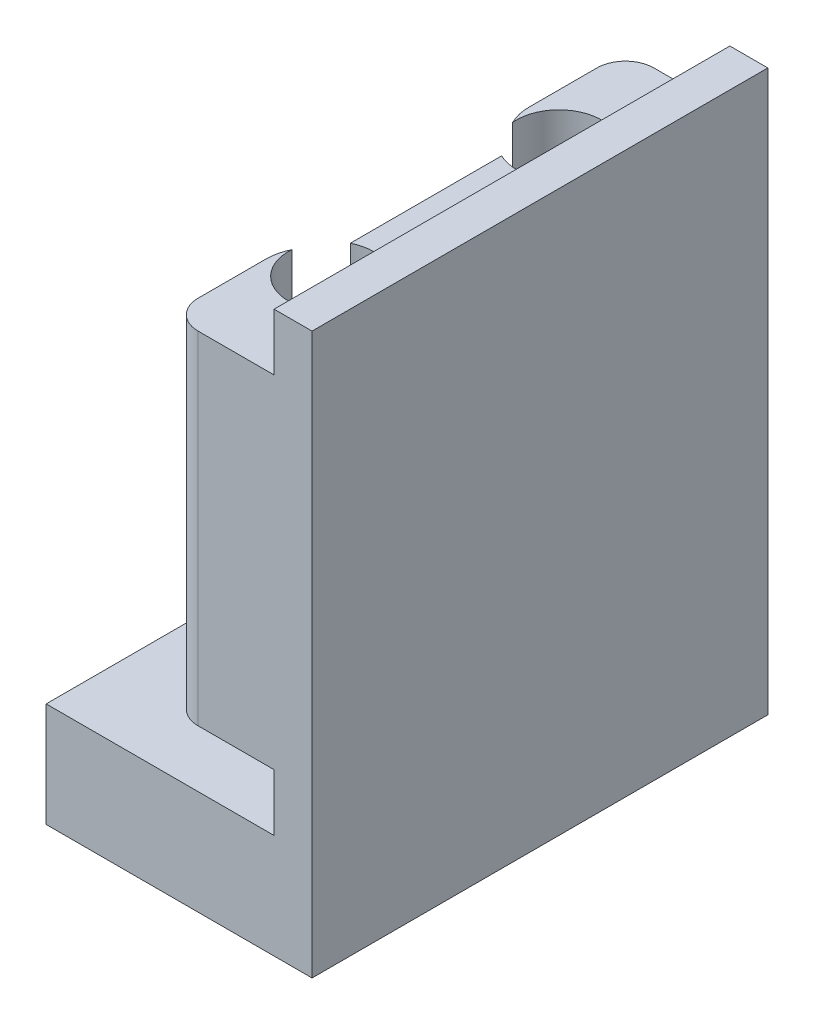
ISO-10303-21;
HEADER;
FILE_DESCRIPTION(('STEP AP214'),'2;1');
FILE_NAME('part.step','',(''),(''),'','','');
FILE_SCHEMA(('AUTOMOTIVE_DESIGN { 1 0 10303 214 1 1 1 1 }'));
ENDSEC;
DATA;
#1=APPLICATION_CONTEXT('core data for automotive mechanical design processes');
#2=APPLICATION_PROTOCOL_DEFINITION('international standard','automotive_design',2000,#1);
#3=PRODUCT_CONTEXT('',#1,'mechanical');
#4=PRODUCT('Part','Part','',(#3));
#5=PRODUCT_RELATED_PRODUCT_CATEGORY('part','',(#4));
#6=PRODUCT_DEFINITION_FORMATION('','',#4);
#7=PRODUCT_DEFINITION_CONTEXT('part definition',#1,'design');
#8=PRODUCT_DEFINITION('design','',#6,#7);
#9=PRODUCT_DEFINITION_SHAPE('','',#8);
#10=(LENGTH_UNIT() NAMED_UNIT(*) SI_UNIT(.MILLI.,.METRE.));
#11=(NAMED_UNIT(*) PLANE_ANGLE_UNIT() SI_UNIT($,.RADIAN.));
#12=(NAMED_UNIT(*) SI_UNIT($,.STERADIAN.) SOLID_ANGLE_UNIT());
#13=UNCERTAINTY_MEASURE_WITH_UNIT(LENGTH_MEASURE(1.E-05),#10,'distance_accuracy_value','');
#14=(GEOMETRIC_REPRESENTATION_CONTEXT(3) GLOBAL_UNCERTAINTY_ASSIGNED_CONTEXT((#13)) GLOBAL_UNIT_ASSIGNED_CONTEXT((#10,
#11,#12)) REPRESENTATION_CONTEXT('',''));
#15=CARTESIAN_POINT('',(0.,0.,0.));
#16=DIRECTION('',(0.,0.,1.));
#17=DIRECTION('',(1.,0.,0.));
#18=AXIS2_PLACEMENT_3D('',#15,#16,#17);
#19=CARTESIAN_POINT('',(0.500000000000001,26.5,12.));
#20=DIRECTION('',(1.,0.,0.));
#21=DIRECTION('',(0.,0.,-1.));
#22=AXIS2_PLACEMENT_3D('',#19,#20,#21);
#23=PLANE('',#22);
#24=DIRECTION('',(0.,0.,1.));
#25=VECTOR('',#24,1.);
#26=CARTESIAN_POINT('',(0.500000000000001,26.5,12.));
#27=LINE('',#26,#25);
#28=CARTESIAN_POINT('',(0.500000000000001,26.5,-10.5));
#29=VERTEX_POINT('',#28);
#30=CARTESIAN_POINT('',(0.500000000000001,26.5,-6.91628784747792));
#31=VERTEX_POINT('',#30);
#32=EDGE_CURVE('E203',#29,#31,#27,.T.);
#33=ORIENTED_EDGE('',*,*,#32,.F.);
#34=DIRECTION('',(0.,-1.,0.));
#35=VECTOR('',#34,1.);
#36=CARTESIAN_POINT('',(0.500000000000001,26.5,-10.5));
#37=LINE('',#36,#35);
#38=CARTESIAN_POINT('',(0.500000000000001,8.5,-10.5));
#39=VERTEX_POINT('',#38);
#40=EDGE_CURVE('E278',#29,#39,#37,.T.);
#41=ORIENTED_EDGE('',*,*,#40,.T.);
#42=DIRECTION('',(0.,0.,1.));
#43=VECTOR('',#42,1.);
#44=CARTESIAN_POINT('',(0.500000000000001,8.5,12.));
#45=LINE('',#44,#43);
#46=CARTESIAN_POINT('',(0.500000000000001,8.5,-6.91628784747792));
#47=VERTEX_POINT('',#46);
#48=EDGE_CURVE('E211',#39,#47,#45,.T.);
#49=ORIENTED_EDGE('',*,*,#48,.T.);
#50=DIRECTION('',(0.,1.,0.));
#51=VECTOR('',#50,1.);
#52=CARTESIAN_POINT('',(0.500000000000001,26.5,-6.91628784747792));
#53=LINE('',#52,#51);
#54=EDGE_CURVE('E271',#47,#31,#53,.T.);
#55=ORIENTED_EDGE('',*,*,#54,.T.);
#56=EDGE_LOOP('',(#33,#41,#49,#55));
#57=FACE_BOUND('',#56,.T.);
#58=ADVANCED_FACE('F37',(#57),#23,.F.);
#59=CARTESIAN_POINT('',(6.,29.5,12.));
#60=DIRECTION('',(1.,0.,0.));
#61=DIRECTION('',(0.,0.,-1.));
#62=AXIS2_PLACEMENT_3D('',#59,#60,#61);
#63=PLANE('',#62);
#64=DIRECTION('',(0.,0.,-1.));
#65=VECTOR('',#64,1.);
#66=CARTESIAN_POINT('',(6.,8.5,12.));
#67=LINE('',#66,#65);
#68=CARTESIAN_POINT('',(6.,8.5,12.));
#69=VERTEX_POINT('',#68);
#70=CARTESIAN_POINT('',(6.,8.5,-12.));
#71=VERTEX_POINT('',#70);
#72=EDGE_CURVE('E187',#69,#71,#67,.T.);
#73=ORIENTED_EDGE('',*,*,#72,.T.);
#74=DIRECTION('',(0.,-1.,0.));
#75=VECTOR('',#74,1.);
#76=CARTESIAN_POINT('',(6.,29.5,-12.));
#77=LINE('',#76,#75);
#78=CARTESIAN_POINT('',(6.,5.5,-12.));
#79=VERTEX_POINT('',#78);
#80=EDGE_CURVE('E223',#71,#79,#77,.T.);
#81=ORIENTED_EDGE('',*,*,#80,.T.);
#82=DIRECTION('',(0.,0.,-1.));
#83=VECTOR('',#82,1.);
#84=CARTESIAN_POINT('',(6.,5.5,12.));
#85=LINE('',#84,#83);
#86=CARTESIAN_POINT('',(6.,5.5,12.));
#87=VERTEX_POINT('',#86);
#88=EDGE_CURVE('E239',#87,#79,#85,.T.);
#89=ORIENTED_EDGE('',*,*,#88,.F.);
#90=DIRECTION('',(0.,-1.,0.));
#91=VECTOR('',#90,1.);
#92=CARTESIAN_POINT('',(6.,29.5,12.));
#93=LINE('',#92,#91);
#94=EDGE_CURVE('E234',#69,#87,#93,.T.);
#95=ORIENTED_EDGE('',*,*,#94,.F.);
#96=EDGE_LOOP('',(#73,#81,#89,#95));
#97=FACE_BOUND('',#96,.T.);
#98=ADVANCED_FACE('F304',(#97),#63,.F.);
#99=CARTESIAN_POINT('',(-6.,5.5,-12.));
#100=DIRECTION('',(0.,0.,1.));
#101=DIRECTION('',(1.,0.,0.));
#102=AXIS2_PLACEMENT_3D('',#99,#100,#101);
#103=PLANE('',#102);
#104=DIRECTION('',(-1.,0.,0.));
#105=VECTOR('',#104,1.);
#106=CARTESIAN_POINT('',(6.,8.5,-12.));
#107=LINE('',#106,#105);
#108=CARTESIAN_POINT('',(2.,8.5,-12.));
#109=VERTEX_POINT('',#108);
#110=EDGE_CURVE('E190',#71,#109,#107,.T.);
#111=ORIENTED_EDGE('',*,*,#110,.T.);
#112=DIRECTION('',(0.,-1.,0.));
#113=VECTOR('',#112,1.);
#114=CARTESIAN_POINT('',(2.,5.5,-12.));
#115=LINE('',#114,#113);
#116=CARTESIAN_POINT('',(2.,26.5,-12.));
#117=VERTEX_POINT('',#116);
#118=EDGE_CURVE('E285',#109,#117,#115,.F.);
#119=ORIENTED_EDGE('',*,*,#118,.T.);
#120=DIRECTION('',(-1.,0.,0.));
#121=VECTOR('',#120,1.);
#122=CARTESIAN_POINT('',(6.,26.5,-12.));
#123=LINE('',#122,#121);
#124=CARTESIAN_POINT('',(6.,26.5,-12.));
#125=VERTEX_POINT('',#124);
#126=EDGE_CURVE('E199',#125,#117,#123,.T.);
#127=ORIENTED_EDGE('',*,*,#126,.F.);
#128=CARTESIAN_POINT('',(6.,29.5,-12.));
#129=VERTEX_POINT('',#128);
#130=EDGE_CURVE('E226',#129,#125,#77,.T.);
#131=ORIENTED_EDGE('',*,*,#130,.F.);
#132=DIRECTION('',(-1.,0.,0.));
#133=VECTOR('',#132,1.);
#134=CARTESIAN_POINT('',(6.,29.5,-12.));
#135=LINE('',#134,#133);
#136=CARTESIAN_POINT('',(8.,29.5,-12.));
#137=VERTEX_POINT('',#136);
#138=EDGE_CURVE('E221',#137,#129,#135,.T.);
#139=ORIENTED_EDGE('',*,*,#138,.F.);
#140=DIRECTION('',(0.,-1.,0.));
#141=VECTOR('',#140,1.);
#142=CARTESIAN_POINT('',(8.,29.5,-12.));
#143=LINE('',#142,#141);
#144=CARTESIAN_POINT('',(8.,0.,-12.));
#145=VERTEX_POINT('',#144);
#146=EDGE_CURVE('E228',#137,#145,#143,.T.);
#147=ORIENTED_EDGE('',*,*,#146,.T.);
#148=DIRECTION('',(-1.,0.,0.));
#149=VECTOR('',#148,1.);
#150=CARTESIAN_POINT('',(-6.,0.,-12.));
#151=LINE('',#150,#149);
#152=CARTESIAN_POINT('',(-6.,0.,-12.));
#153=VERTEX_POINT('',#152);
#154=EDGE_CURVE('E238',#145,#153,#151,.T.);
#155=ORIENTED_EDGE('',*,*,#154,.T.);
#156=DIRECTION('',(0.,-1.,0.));
#157=VECTOR('',#156,1.);
#158=CARTESIAN_POINT('',(-6.,5.5,-12.));
#159=LINE('',#158,#157);
#160=CARTESIAN_POINT('',(-6.,5.5,-12.));
#161=VERTEX_POINT('',#160);
#162=EDGE_CURVE('E257',#161,#153,#159,.T.);
#163=ORIENTED_EDGE('',*,*,#162,.F.);
#164=DIRECTION('',(-1.,0.,0.));
#165=VECTOR('',#164,1.);
#166=CARTESIAN_POINT('',(-6.,5.5,-12.));
#167=LINE('',#166,#165);
#168=EDGE_CURVE('E242',#79,#161,#167,.T.);
#169=ORIENTED_EDGE('',*,*,#168,.F.);
#170=ORIENTED_EDGE('',*,*,#80,.F.);
#171=EDGE_LOOP('',(#111,#119,#127,#131,#139,#147,#155,#163,#169,#170));
#172=FACE_BOUND('',#171,.T.);
#173=ADVANCED_FACE('F308',(#172),#103,.F.);
#174=CARTESIAN_POINT('',(-6.,5.5,12.));
#175=DIRECTION('',(1.,0.,0.));
#176=DIRECTION('',(0.,0.,-1.));
#177=AXIS2_PLACEMENT_3D('',#174,#175,#176);
#178=PLANE('',#177);
#179=DIRECTION('',(0.,0.,1.));
#180=VECTOR('',#179,1.);
#181=CARTESIAN_POINT('',(-6.,0.,12.));
#182=LINE('',#181,#180);
#183=CARTESIAN_POINT('',(-6.,0.,12.));
#184=VERTEX_POINT('',#183);
#185=EDGE_CURVE('E252',#153,#184,#182,.T.);
#186=ORIENTED_EDGE('',*,*,#185,.T.);
#187=DIRECTION('',(0.,-1.,0.));
#188=VECTOR('',#187,1.);
#189=CARTESIAN_POINT('',(-6.,5.5,12.));
#190=LINE('',#189,#188);
#191=CARTESIAN_POINT('',(-6.,5.5,12.));
#192=VERTEX_POINT('',#191);
#193=EDGE_CURVE('E250',#192,#184,#190,.T.);
#194=ORIENTED_EDGE('',*,*,#193,.F.);
#195=DIRECTION('',(0.,0.,1.));
#196=VECTOR('',#195,1.);
#197=CARTESIAN_POINT('',(-6.,5.5,12.));
#198=LINE('',#197,#196);
#199=EDGE_CURVE('E245',#161,#192,#198,.T.);
#200=ORIENTED_EDGE('',*,*,#199,.F.);
#201=ORIENTED_EDGE('',*,*,#162,.T.);
#202=EDGE_LOOP('',(#186,#194,#200,#201));
#203=FACE_BOUND('',#202,.T.);
#204=ADVANCED_FACE('F418',(#203),#178,.F.);
#205=CARTESIAN_POINT('',(-6.,5.5,12.));
#206=DIRECTION('',(0.,0.,-1.));
#207=DIRECTION('',(-1.,0.,0.));
#208=AXIS2_PLACEMENT_3D('',#205,#206,#207);
#209=PLANE('',#208);
#210=DIRECTION('',(1.,0.,0.));
#211=VECTOR('',#210,1.);
#212=CARTESIAN_POINT('',(6.,26.5,12.));
#213=LINE('',#212,#211);
#214=CARTESIAN_POINT('',(2.,26.5,12.));
#215=VERTEX_POINT('',#214);
#216=CARTESIAN_POINT('',(6.,26.5,12.));
#217=VERTEX_POINT('',#216);
#218=EDGE_CURVE('E205',#215,#217,#213,.T.);
#219=ORIENTED_EDGE('',*,*,#218,.F.);
#220=DIRECTION('',(0.,-1.,0.));
#221=VECTOR('',#220,1.);
#222=CARTESIAN_POINT('',(2.,5.5,12.));
#223=LINE('',#222,#221);
#224=CARTESIAN_POINT('',(2.,8.5,12.));
#225=VERTEX_POINT('',#224);
#226=EDGE_CURVE('E45',#215,#225,#223,.T.);
#227=ORIENTED_EDGE('',*,*,#226,.T.);
#228=DIRECTION('',(1.,0.,0.));
#229=VECTOR('',#228,1.);
#230=CARTESIAN_POINT('',(6.,8.5,12.));
#231=LINE('',#230,#229);
#232=EDGE_CURVE('E200',#225,#69,#231,.T.);
#233=ORIENTED_EDGE('',*,*,#232,.T.);
#234=ORIENTED_EDGE('',*,*,#94,.T.);
#235=DIRECTION('',(1.,0.,0.));
#236=VECTOR('',#235,1.);
#237=CARTESIAN_POINT('',(-6.,5.5,12.));
#238=LINE('',#237,#236);
#239=EDGE_CURVE('E247',#192,#87,#238,.T.);
#240=ORIENTED_EDGE('',*,*,#239,.F.);
#241=ORIENTED_EDGE('',*,*,#193,.T.);
#242=DIRECTION('',(1.,0.,0.));
#243=VECTOR('',#242,1.);
#244=CARTESIAN_POINT('',(-6.,0.,12.));
#245=LINE('',#244,#243);
#246=CARTESIAN_POINT('',(8.,0.,12.));
#247=VERTEX_POINT('',#246);
#248=EDGE_CURVE('E243',#184,#247,#245,.T.);
#249=ORIENTED_EDGE('',*,*,#248,.T.);
#250=DIRECTION('',(0.,-1.,0.));
#251=VECTOR('',#250,1.);
#252=CARTESIAN_POINT('',(8.,29.5,12.));
#253=LINE('',#252,#251);
#254=CARTESIAN_POINT('',(8.,29.5,12.));
#255=VERTEX_POINT('',#254);
#256=EDGE_CURVE('E231',#255,#247,#253,.T.);
#257=ORIENTED_EDGE('',*,*,#256,.F.);
#258=DIRECTION('',(1.,0.,0.));
#259=VECTOR('',#258,1.);
#260=CARTESIAN_POINT('',(6.,29.5,12.));
#261=LINE('',#260,#259);
#262=CARTESIAN_POINT('',(6.,29.5,12.));
#263=VERTEX_POINT('',#262);
#264=EDGE_CURVE('E217',#263,#255,#261,.T.);
#265=ORIENTED_EDGE('',*,*,#264,.F.);
#266=EDGE_CURVE('E235',#263,#217,#93,.T.);
#267=ORIENTED_EDGE('',*,*,#266,.T.);
#268=EDGE_LOOP('',(#219,#227,#233,#234,#240,#241,#249,#257,#265,#267));
#269=FACE_BOUND('',#268,.T.);
#270=ADVANCED_FACE('F293',(#269),#209,.F.);
#271=CARTESIAN_POINT('',(0.,5.5,0.));
#272=DIRECTION('',(0.,-1.,0.));
#273=DIRECTION('',(0.,0.,-1.));
#274=AXIS2_PLACEMENT_3D('',#271,#272,#273);
#275=PLANE('',#274);
#276=CARTESIAN_POINT('',(3.,5.5,6.));
#277=DIRECTION('',(0.,-1.,0.));
#278=DIRECTION('',(0.,0.,-1.));
#279=AXIS2_PLACEMENT_3D('',#276,#277,#278);
#280=CIRCLE('',#279,2.25);
#281=CARTESIAN_POINT('',(3.,5.5,3.75));
#282=VERTEX_POINT('',#281);
#283=EDGE_CURVE('E192',#282,#282,#280,.T.);
#284=ORIENTED_EDGE('',*,*,#283,.T.);
#285=EDGE_LOOP('',(#284));
#286=FACE_BOUND('',#285,.T.);
#287=CARTESIAN_POINT('',(3.,5.5,-6.));
#288=DIRECTION('',(0.,-1.,0.));
#289=DIRECTION('',(0.,0.,-1.));
#290=AXIS2_PLACEMENT_3D('',#287,#288,#289);
#291=CIRCLE('',#290,2.25);
#292=CARTESIAN_POINT('',(3.,5.5,-8.25));
#293=VERTEX_POINT('',#292);
#294=EDGE_CURVE('E172',#293,#293,#291,.T.);
#295=ORIENTED_EDGE('',*,*,#294,.T.);
#296=EDGE_LOOP('',(#295));
#297=FACE_BOUND('',#296,.T.);
#298=ORIENTED_EDGE('',*,*,#88,.T.);
#299=ORIENTED_EDGE('',*,*,#168,.T.);
#300=ORIENTED_EDGE('',*,*,#199,.T.);
#301=ORIENTED_EDGE('',*,*,#239,.T.);
#302=EDGE_LOOP('',(#298,#299,#300,#301));
#303=FACE_BOUND('',#302,.T.);
#304=ADVANCED_FACE('F313',(#286,#297,#303),#275,.F.);
#305=CARTESIAN_POINT('',(0.,0.,0.));
#306=DIRECTION('',(0.,-1.,0.));
#307=DIRECTION('',(0.,0.,-1.));
#308=AXIS2_PLACEMENT_3D('',#305,#306,#307);
#309=PLANE('',#308);
#310=CARTESIAN_POINT('',(3.,0.,6.));
#311=DIRECTION('',(0.,1.,0.));
#312=DIRECTION('',(0.,0.,1.));
#313=AXIS2_PLACEMENT_3D('',#310,#311,#312);
#314=CIRCLE('',#313,2.25);
#315=CARTESIAN_POINT('',(3.,0.,8.25));
#316=VERTEX_POINT('',#315);
#317=EDGE_CURVE('E563',#316,#316,#314,.T.);
#318=ORIENTED_EDGE('',*,*,#317,.T.);
#319=EDGE_LOOP('',(#318));
#320=FACE_BOUND('',#319,.T.);
#321=CARTESIAN_POINT('',(3.,0.,-6.));
#322=DIRECTION('',(0.,1.,0.));
#323=DIRECTION('',(0.,0.,1.));
#324=AXIS2_PLACEMENT_3D('',#321,#322,#323);
#325=CIRCLE('',#324,2.25);
#326=CARTESIAN_POINT('',(3.,0.,-3.75));
#327=VERTEX_POINT('',#326);
#328=EDGE_CURVE('E182',#327,#327,#325,.T.);
#329=ORIENTED_EDGE('',*,*,#328,.T.);
#330=EDGE_LOOP('',(#329));
#331=FACE_BOUND('',#330,.T.);
#332=ORIENTED_EDGE('',*,*,#154,.F.);
#333=DIRECTION('',(0.,0.,-1.));
#334=VECTOR('',#333,1.);
#335=CARTESIAN_POINT('',(8.,0.,12.));
#336=LINE('',#335,#334);
#337=EDGE_CURVE('E206',#247,#145,#336,.T.);
#338=ORIENTED_EDGE('',*,*,#337,.F.);
#339=ORIENTED_EDGE('',*,*,#248,.F.);
#340=ORIENTED_EDGE('',*,*,#185,.F.);
#341=EDGE_LOOP('',(#332,#338,#339,#340));
#342=FACE_BOUND('',#341,.T.);
#343=ADVANCED_FACE('F322',(#320,#331,#342),#309,.T.);
#344=ORIENTED_EDGE('',*,*,#130,.T.);
#345=DIRECTION('',(0.,0.,-1.));
#346=VECTOR('',#345,1.);
#347=CARTESIAN_POINT('',(6.,26.5,12.));
#348=LINE('',#347,#346);
#349=EDGE_CURVE('E196',#217,#125,#348,.T.);
#350=ORIENTED_EDGE('',*,*,#349,.F.);
#351=ORIENTED_EDGE('',*,*,#266,.F.);
#352=DIRECTION('',(0.,0.,1.));
#353=VECTOR('',#352,1.);
#354=CARTESIAN_POINT('',(6.,29.5,12.));
#355=LINE('',#354,#353);
#356=EDGE_CURVE('E214',#129,#263,#355,.T.);
#357=ORIENTED_EDGE('',*,*,#356,.F.);
#358=EDGE_LOOP('',(#344,#350,#351,#357));
#359=FACE_BOUND('',#358,.T.);
#360=ADVANCED_FACE('F336',(#359),#63,.F.);
#361=CARTESIAN_POINT('',(8.,29.5,12.));
#362=DIRECTION('',(-1.,0.,0.));
#363=DIRECTION('',(0.,0.,1.));
#364=AXIS2_PLACEMENT_3D('',#361,#362,#363);
#365=PLANE('',#364);
#366=ORIENTED_EDGE('',*,*,#337,.T.);
#367=ORIENTED_EDGE('',*,*,#146,.F.);
#368=DIRECTION('',(0.,0.,-1.));
#369=VECTOR('',#368,1.);
#370=CARTESIAN_POINT('',(8.,29.5,12.));
#371=LINE('',#370,#369);
#372=EDGE_CURVE('E219',#255,#137,#371,.T.);
#373=ORIENTED_EDGE('',*,*,#372,.F.);
#374=ORIENTED_EDGE('',*,*,#256,.T.);
#375=EDGE_LOOP('',(#366,#367,#373,#374));
#376=FACE_BOUND('',#375,.T.);
#377=ADVANCED_FACE('F325',(#376),#365,.F.);
#378=CARTESIAN_POINT('',(0.,29.5,0.));
#379=DIRECTION('',(0.,-1.,0.));
#380=DIRECTION('',(0.,0.,-1.));
#381=AXIS2_PLACEMENT_3D('',#378,#379,#380);
#382=PLANE('',#381);
#383=ORIENTED_EDGE('',*,*,#356,.T.);
#384=ORIENTED_EDGE('',*,*,#264,.T.);
#385=ORIENTED_EDGE('',*,*,#372,.T.);
#386=ORIENTED_EDGE('',*,*,#138,.T.);
#387=EDGE_LOOP('',(#383,#384,#385,#386));
#388=FACE_BOUND('',#387,.T.);
#389=ADVANCED_FACE('F332',(#388),#382,.F.);
#390=CARTESIAN_POINT('',(0.500000000000001,8.5,6.91628784747793));
#391=VERTEX_POINT('',#390);
#392=CARTESIAN_POINT('',(0.500000000000001,8.5,10.5));
#393=VERTEX_POINT('',#392);
#394=EDGE_CURVE('E210',#391,#393,#45,.T.);
#395=ORIENTED_EDGE('',*,*,#394,.T.);
#396=DIRECTION('',(0.,-1.,0.));
#397=VECTOR('',#396,1.);
#398=CARTESIAN_POINT('',(0.500000000000001,26.5,10.5));
#399=LINE('',#398,#397);
#400=CARTESIAN_POINT('',(0.500000000000001,26.5,10.5));
#401=VERTEX_POINT('',#400);
#402=EDGE_CURVE('E11',#393,#401,#399,.F.);
#403=ORIENTED_EDGE('',*,*,#402,.T.);
#404=CARTESIAN_POINT('',(0.500000000000001,26.5,6.91628784747792));
#405=VERTEX_POINT('',#404);
#406=EDGE_CURVE('E202',#405,#401,#27,.T.);
#407=ORIENTED_EDGE('',*,*,#406,.F.);
#408=DIRECTION('',(0.,-1.,0.));
#409=VECTOR('',#408,1.);
#410=CARTESIAN_POINT('',(0.500000000000001,26.5,6.91628784747792));
#411=LINE('',#410,#409);
#412=EDGE_CURVE('E263',#405,#391,#411,.T.);
#413=ORIENTED_EDGE('',*,*,#412,.T.);
#414=EDGE_LOOP('',(#395,#403,#407,#413));
#415=FACE_BOUND('',#414,.T.);
#416=ADVANCED_FACE('F361',(#415),#23,.F.);
#417=CARTESIAN_POINT('',(0.,26.5,0.));
#418=DIRECTION('',(0.,1.,0.));
#419=DIRECTION('',(0.,0.,1.));
#420=AXIS2_PLACEMENT_3D('',#417,#418,#419);
#421=PLANE('',#420);
#422=ORIENTED_EDGE('',*,*,#126,.T.);
#423=CARTESIAN_POINT('',(2.,26.5,-10.5));
#424=DIRECTION('',(0.,1.,0.));
#425=DIRECTION('',(0.,0.,1.));
#426=AXIS2_PLACEMENT_3D('',#423,#424,#425);
#427=CIRCLE('',#426,1.5);
#428=EDGE_CURVE('E288',#117,#29,#427,.T.);
#429=ORIENTED_EDGE('',*,*,#428,.T.);
#430=ORIENTED_EDGE('',*,*,#32,.T.);
#431=CARTESIAN_POINT('',(3.,26.5,-6.91628784747792));
#432=DIRECTION('',(0.,1.,0.));
#433=DIRECTION('',(0.,0.,1.));
#434=AXIS2_PLACEMENT_3D('',#431,#432,#433);
#435=CIRCLE('',#434,2.5);
#436=CARTESIAN_POINT('',(0.758023964105944,26.5,-5.81014886232426));
#437=VERTEX_POINT('',#436);
#438=EDGE_CURVE('E181',#31,#437,#435,.T.);
#439=ORIENTED_EDGE('',*,*,#438,.T.);
#440=CARTESIAN_POINT('',(3.,26.5,-6.));
#441=DIRECTION('',(0.,1.,0.));
#442=DIRECTION('',(0.,0.,1.));
#443=AXIS2_PLACEMENT_3D('',#440,#441,#442);
#444=CIRCLE('',#443,2.25);
#445=CARTESIAN_POINT('',(2.,26.5,-3.98443556292536));
#446=VERTEX_POINT('',#445);
#447=EDGE_CURVE('E164',#446,#437,#444,.T.);
#448=ORIENTED_EDGE('',*,*,#447,.F.);
#449=DIRECTION('',(0.,0.,-1.));
#450=VECTOR('',#449,1.);
#451=CARTESIAN_POINT('',(2.,26.5,-4.625));
#452=LINE('',#451,#450);
#453=CARTESIAN_POINT('',(2.,26.5,3.98443556292536));
#454=VERTEX_POINT('',#453);
#455=EDGE_CURVE('E179',#454,#446,#452,.T.);
#456=ORIENTED_EDGE('',*,*,#455,.F.);
#457=CARTESIAN_POINT('',(3.,26.5,6.));
#458=DIRECTION('',(0.,1.,0.));
#459=DIRECTION('',(0.,0.,1.));
#460=AXIS2_PLACEMENT_3D('',#457,#458,#459);
#461=CIRCLE('',#460,2.25);
#462=CARTESIAN_POINT('',(0.758023964105944,26.5,5.81014886232426));
#463=VERTEX_POINT('',#462);
#464=EDGE_CURVE('E399',#463,#454,#461,.T.);
#465=ORIENTED_EDGE('',*,*,#464,.F.);
#466=CARTESIAN_POINT('',(3.,26.5,6.91628784747792));
#467=DIRECTION('',(0.,1.,0.));
#468=DIRECTION('',(0.,0.,1.));
#469=AXIS2_PLACEMENT_3D('',#466,#467,#468);
#470=CIRCLE('',#469,2.5);
#471=EDGE_CURVE('E261',#463,#405,#470,.T.);
#472=ORIENTED_EDGE('',*,*,#471,.T.);
#473=ORIENTED_EDGE('',*,*,#406,.T.);
#474=CARTESIAN_POINT('',(2.,26.5,10.5));
#475=DIRECTION('',(0.,1.,0.));
#476=DIRECTION('',(0.,0.,1.));
#477=AXIS2_PLACEMENT_3D('',#474,#475,#476);
#478=CIRCLE('',#477,1.5);
#479=EDGE_CURVE('E52',#401,#215,#478,.T.);
#480=ORIENTED_EDGE('',*,*,#479,.T.);
#481=ORIENTED_EDGE('',*,*,#218,.T.);
#482=ORIENTED_EDGE('',*,*,#349,.T.);
#483=EDGE_LOOP('',(#422,#429,#430,#439,#448,#456,#465,#472,#473,#480,#481,#482));
#484=FACE_BOUND('',#483,.T.);
#485=ADVANCED_FACE('F177',(#484),#421,.T.);
#486=CARTESIAN_POINT('',(0.,8.5,0.));
#487=DIRECTION('',(0.,1.,0.));
#488=DIRECTION('',(0.,0.,1.));
#489=AXIS2_PLACEMENT_3D('',#486,#487,#488);
#490=PLANE('',#489);
#491=ORIENTED_EDGE('',*,*,#48,.F.);
#492=CARTESIAN_POINT('',(2.,8.5,-10.5));
#493=DIRECTION('',(0.,1.,0.));
#494=DIRECTION('',(0.,0.,1.));
#495=AXIS2_PLACEMENT_3D('',#492,#493,#494);
#496=CIRCLE('',#495,1.5);
#497=EDGE_CURVE('E283',#39,#109,#496,.F.);
#498=ORIENTED_EDGE('',*,*,#497,.T.);
#499=ORIENTED_EDGE('',*,*,#110,.F.);
#500=ORIENTED_EDGE('',*,*,#72,.F.);
#501=ORIENTED_EDGE('',*,*,#232,.F.);
#502=CARTESIAN_POINT('',(2.,8.5,10.5));
#503=DIRECTION('',(0.,1.,0.));
#504=DIRECTION('',(0.,0.,1.));
#505=AXIS2_PLACEMENT_3D('',#502,#503,#504);
#506=CIRCLE('',#505,1.5);
#507=EDGE_CURVE('E281',#225,#393,#506,.F.);
#508=ORIENTED_EDGE('',*,*,#507,.T.);
#509=ORIENTED_EDGE('',*,*,#394,.F.);
#510=CARTESIAN_POINT('',(3.,8.5,6.91628784747793));
#511=DIRECTION('',(0.,1.,0.));
#512=DIRECTION('',(0.,0.,1.));
#513=AXIS2_PLACEMENT_3D('',#510,#511,#512);
#514=CIRCLE('',#513,2.5);
#515=CARTESIAN_POINT('',(0.758023964105944,8.5,5.81014886232427));
#516=VERTEX_POINT('',#515);
#517=EDGE_CURVE('E268',#391,#516,#514,.F.);
#518=ORIENTED_EDGE('',*,*,#517,.T.);
#519=CARTESIAN_POINT('',(3.,8.5,6.));
#520=DIRECTION('',(0.,1.,0.));
#521=DIRECTION('',(0.,0.,1.));
#522=AXIS2_PLACEMENT_3D('',#519,#520,#521);
#523=CIRCLE('',#522,2.25);
#524=CARTESIAN_POINT('',(2.,8.5,3.98443556292536));
#525=VERTEX_POINT('',#524);
#526=EDGE_CURVE('E397',#516,#525,#523,.T.);
#527=ORIENTED_EDGE('',*,*,#526,.T.);
#528=DIRECTION('',(0.,0.,1.));
#529=VECTOR('',#528,1.);
#530=CARTESIAN_POINT('',(2.,8.5,-4.625));
#531=LINE('',#530,#529);
#532=CARTESIAN_POINT('',(2.,8.5,-3.98443556292536));
#533=VERTEX_POINT('',#532);
#534=EDGE_CURVE('E188',#533,#525,#531,.T.);
#535=ORIENTED_EDGE('',*,*,#534,.F.);
#536=CARTESIAN_POINT('',(3.,8.5,-6.));
#537=DIRECTION('',(0.,1.,0.));
#538=DIRECTION('',(0.,0.,1.));
#539=AXIS2_PLACEMENT_3D('',#536,#537,#538);
#540=CIRCLE('',#539,2.25);
#541=CARTESIAN_POINT('',(0.758023964105944,8.5,-5.81014886232426));
#542=VERTEX_POINT('',#541);
#543=EDGE_CURVE('E167',#533,#542,#540,.T.);
#544=ORIENTED_EDGE('',*,*,#543,.T.);
#545=CARTESIAN_POINT('',(3.,8.5,-6.91628784747792));
#546=DIRECTION('',(0.,1.,0.));
#547=DIRECTION('',(0.,0.,1.));
#548=AXIS2_PLACEMENT_3D('',#545,#546,#547);
#549=CIRCLE('',#548,2.5);
#550=EDGE_CURVE('E265',#542,#47,#549,.F.);
#551=ORIENTED_EDGE('',*,*,#550,.T.);
#552=EDGE_LOOP('',(#491,#498,#499,#500,#501,#508,#509,#518,#527,#535,#544,#551));
#553=FACE_BOUND('',#552,.T.);
#554=ADVANCED_FACE('F299',(#553),#490,.F.);
#555=CARTESIAN_POINT('',(2.,0.,0.));
#556=DIRECTION('',(-1.,0.,0.));
#557=DIRECTION('',(0.,0.,1.));
#558=AXIS2_PLACEMENT_3D('',#555,#556,#557);
#559=PLANE('',#558);
#560=DIRECTION('',(0.,1.,0.));
#561=VECTOR('',#560,1.);
#562=CARTESIAN_POINT('',(2.,0.,3.98443556292536));
#563=LINE('',#562,#561);
#564=EDGE_CURVE('E186',#454,#525,#563,.F.);
#565=ORIENTED_EDGE('',*,*,#564,.F.);
#566=ORIENTED_EDGE('',*,*,#455,.T.);
#567=DIRECTION('',(0.,1.,0.));
#568=VECTOR('',#567,1.);
#569=CARTESIAN_POINT('',(2.,0.,-3.98443556292536));
#570=LINE('',#569,#568);
#571=EDGE_CURVE('E161',#533,#446,#570,.T.);
#572=ORIENTED_EDGE('',*,*,#571,.F.);
#573=ORIENTED_EDGE('',*,*,#534,.T.);
#574=EDGE_LOOP('',(#565,#566,#572,#573));
#575=FACE_BOUND('',#574,.T.);
#576=ADVANCED_FACE('F185',(#575),#559,.T.);
#577=CARTESIAN_POINT('',(3.,26.5,6.91628784747792));
#578=DIRECTION('',(0.,-1.,0.));
#579=DIRECTION('',(0.,0.,-1.));
#580=AXIS2_PLACEMENT_3D('',#577,#578,#579);
#581=CYLINDRICAL_SURFACE('',#580,2.5);
#582=DIRECTION('',(0.,1.,0.));
#583=VECTOR('',#582,1.);
#584=CARTESIAN_POINT('',(0.758023964105944,13.25,5.81014886232427));
#585=LINE('',#584,#583);
#586=EDGE_CURVE('E276',#516,#463,#585,.T.);
#587=ORIENTED_EDGE('',*,*,#586,.F.);
#588=ORIENTED_EDGE('',*,*,#517,.F.);
#589=ORIENTED_EDGE('',*,*,#412,.F.);
#590=ORIENTED_EDGE('',*,*,#471,.F.);
#591=EDGE_LOOP('',(#587,#588,#589,#590));
#592=FACE_BOUND('',#591,.T.);
#593=ADVANCED_FACE('F348',(#592),#581,.T.);
#594=CARTESIAN_POINT('',(3.,26.5,-6.91628784747792));
#595=DIRECTION('',(0.,1.,0.));
#596=DIRECTION('',(0.,0.,1.));
#597=AXIS2_PLACEMENT_3D('',#594,#595,#596);
#598=CYLINDRICAL_SURFACE('',#597,2.5);
#599=DIRECTION('',(0.,1.,0.));
#600=VECTOR('',#599,1.);
#601=CARTESIAN_POINT('',(0.758023964105944,13.25,-5.81014886232426));
#602=LINE('',#601,#600);
#603=EDGE_CURVE('E274',#437,#542,#602,.F.);
#604=ORIENTED_EDGE('',*,*,#603,.F.);
#605=ORIENTED_EDGE('',*,*,#438,.F.);
#606=ORIENTED_EDGE('',*,*,#54,.F.);
#607=ORIENTED_EDGE('',*,*,#550,.F.);
#608=EDGE_LOOP('',(#604,#605,#606,#607));
#609=FACE_BOUND('',#608,.T.);
#610=ADVANCED_FACE('F346',(#609),#598,.T.);
#611=CARTESIAN_POINT('',(3.,0.,-6.));
#612=DIRECTION('',(0.,1.,0.));
#613=DIRECTION('',(0.,0.,1.));
#614=AXIS2_PLACEMENT_3D('',#611,#612,#613);
#615=CYLINDRICAL_SURFACE('',#614,2.25);
#616=ORIENTED_EDGE('',*,*,#571,.T.);
#617=ORIENTED_EDGE('',*,*,#447,.T.);
#618=ORIENTED_EDGE('',*,*,#603,.T.);
#619=ORIENTED_EDGE('',*,*,#543,.F.);
#620=EDGE_LOOP('',(#616,#617,#618,#619));
#621=FACE_BOUND('',#620,.T.);
#622=ADVANCED_FACE('F163',(#621),#615,.F.);
#623=CARTESIAN_POINT('',(3.,0.,6.));
#624=DIRECTION('',(0.,1.,0.));
#625=DIRECTION('',(0.,0.,1.));
#626=AXIS2_PLACEMENT_3D('',#623,#624,#625);
#627=CYLINDRICAL_SURFACE('',#626,2.25);
#628=ORIENTED_EDGE('',*,*,#564,.T.);
#629=ORIENTED_EDGE('',*,*,#526,.F.);
#630=ORIENTED_EDGE('',*,*,#586,.T.);
#631=ORIENTED_EDGE('',*,*,#464,.T.);
#632=EDGE_LOOP('',(#628,#629,#630,#631));
#633=FACE_BOUND('',#632,.T.);
#634=ADVANCED_FACE('F354',(#633),#627,.F.);
#635=ORIENTED_EDGE('',*,*,#328,.F.);
#636=EDGE_LOOP('',(#635));
#637=FACE_BOUND('',#636,.T.);
#638=ORIENTED_EDGE('',*,*,#294,.F.);
#639=EDGE_LOOP('',(#638));
#640=FACE_BOUND('',#639,.T.);
#641=ADVANCED_FACE('F356',(#637,#640),#615,.F.);
#642=ORIENTED_EDGE('',*,*,#317,.F.);
#643=EDGE_LOOP('',(#642));
#644=FACE_BOUND('',#643,.T.);
#645=ORIENTED_EDGE('',*,*,#283,.F.);
#646=EDGE_LOOP('',(#645));
#647=FACE_BOUND('',#646,.T.);
#648=ADVANCED_FACE('F380',(#644,#647),#627,.F.);
#649=CARTESIAN_POINT('',(2.,26.5,-10.5));
#650=DIRECTION('',(0.,-1.,0.));
#651=DIRECTION('',(0.,0.,-1.));
#652=AXIS2_PLACEMENT_3D('',#649,#650,#651);
#653=CYLINDRICAL_SURFACE('',#652,1.5);
#654=ORIENTED_EDGE('',*,*,#428,.F.);
#655=ORIENTED_EDGE('',*,*,#118,.F.);
#656=ORIENTED_EDGE('',*,*,#497,.F.);
#657=ORIENTED_EDGE('',*,*,#40,.F.);
#658=EDGE_LOOP('',(#654,#655,#656,#657));
#659=FACE_BOUND('',#658,.T.);
#660=ADVANCED_FACE('F341',(#659),#653,.T.);
#661=CARTESIAN_POINT('',(2.,5.5,10.5));
#662=DIRECTION('',(0.,-1.,0.));
#663=DIRECTION('',(0.,0.,-1.));
#664=AXIS2_PLACEMENT_3D('',#661,#662,#663);
#665=CYLINDRICAL_SURFACE('',#664,1.5);
#666=ORIENTED_EDGE('',*,*,#479,.F.);
#667=ORIENTED_EDGE('',*,*,#402,.F.);
#668=ORIENTED_EDGE('',*,*,#507,.F.);
#669=ORIENTED_EDGE('',*,*,#226,.F.);
#670=EDGE_LOOP('',(#666,#667,#668,#669));
#671=FACE_BOUND('',#670,.T.);
#672=ADVANCED_FACE('F39',(#671),#665,.T.);
#673=CLOSED_SHELL('',(#58,#98,#173,#204,#270,#304,#343,#360,#377,#389,#416,#485,#554,#576,#593,
#610,#622,#634,#641,#648,#660,#672));
#674=MANIFOLD_SOLID_BREP('B2',#673);
#675=ADVANCED_BREP_SHAPE_REPRESENTATION('',(#18,#674),#14);
#676=SHAPE_DEFINITION_REPRESENTATION(#9,#675);
ENDSEC;
END-ISO-10303-21;
